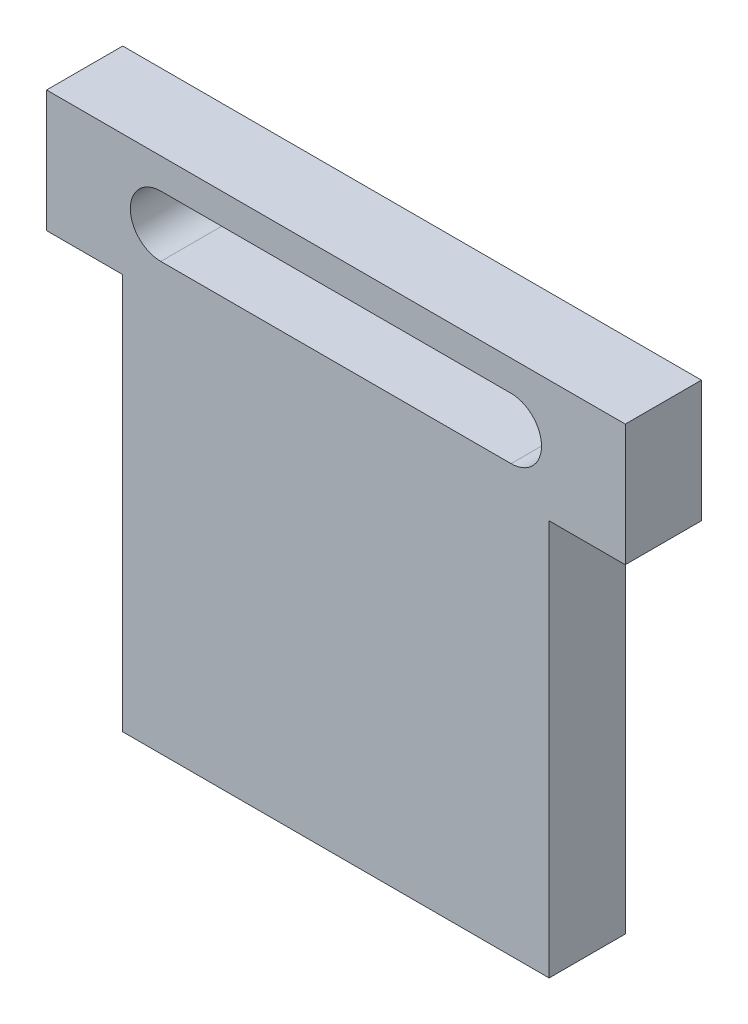
ISO-10303-21;
HEADER;
FILE_DESCRIPTION(('STEP AP214'),'2;1');
FILE_NAME('part.step','',(''),(''),'','','');
FILE_SCHEMA(('AUTOMOTIVE_DESIGN { 1 0 10303 214 1 1 1 1 }'));
ENDSEC;
DATA;
#1=APPLICATION_CONTEXT('core data for automotive mechanical design processes');
#2=APPLICATION_PROTOCOL_DEFINITION('international standard','automotive_design',2000,#1);
#3=PRODUCT_CONTEXT('',#1,'mechanical');
#4=PRODUCT('Part','Part','',(#3));
#5=PRODUCT_RELATED_PRODUCT_CATEGORY('part','',(#4));
#6=PRODUCT_DEFINITION_FORMATION('','',#4);
#7=PRODUCT_DEFINITION_CONTEXT('part definition',#1,'design');
#8=PRODUCT_DEFINITION('design','',#6,#7);
#9=PRODUCT_DEFINITION_SHAPE('','',#8);
#10=(LENGTH_UNIT() NAMED_UNIT(*) SI_UNIT(.MILLI.,.METRE.));
#11=(NAMED_UNIT(*) PLANE_ANGLE_UNIT() SI_UNIT($,.RADIAN.));
#12=(NAMED_UNIT(*) SI_UNIT($,.STERADIAN.) SOLID_ANGLE_UNIT());
#13=UNCERTAINTY_MEASURE_WITH_UNIT(LENGTH_MEASURE(1.E-05),#10,'distance_accuracy_value','');
#14=(GEOMETRIC_REPRESENTATION_CONTEXT(3) GLOBAL_UNCERTAINTY_ASSIGNED_CONTEXT((#13)) GLOBAL_UNIT_ASSIGNED_CONTEXT((#10,
#11,#12)) REPRESENTATION_CONTEXT('',''));
#15=CARTESIAN_POINT('',(0.,0.,0.));
#16=DIRECTION('',(0.,0.,1.));
#17=DIRECTION('',(1.,0.,0.));
#18=AXIS2_PLACEMENT_3D('',#15,#16,#17);
#19=CARTESIAN_POINT('',(-19.,28.5,-9.5));
#20=DIRECTION('',(-1.,0.,0.));
#21=DIRECTION('',(0.,0.,1.));
#22=AXIS2_PLACEMENT_3D('',#19,#20,#21);
#23=PLANE('',#22);
#24=DIRECTION('',(0.,-1.,0.));
#25=VECTOR('',#24,1.);
#26=CARTESIAN_POINT('',(-19.,28.5,-4.5));
#27=LINE('',#26,#25);
#28=CARTESIAN_POINT('',(-19.,36.5,-4.5));
#29=VERTEX_POINT('',#28);
#30=CARTESIAN_POINT('',(-19.,28.5,-4.5));
#31=VERTEX_POINT('',#30);
#32=EDGE_CURVE('E150',#29,#31,#27,.T.);
#33=ORIENTED_EDGE('',*,*,#32,.F.);
#34=DIRECTION('',(0.,0.,1.));
#35=VECTOR('',#34,1.);
#36=CARTESIAN_POINT('',(-19.,36.5,-9.5));
#37=LINE('',#36,#35);
#38=CARTESIAN_POINT('',(-19.,36.5,-9.5));
#39=VERTEX_POINT('',#38);
#40=EDGE_CURVE('E203',#39,#29,#37,.T.);
#41=ORIENTED_EDGE('',*,*,#40,.F.);
#42=DIRECTION('',(0.,-1.,0.));
#43=VECTOR('',#42,1.);
#44=CARTESIAN_POINT('',(-19.,28.5,-9.5));
#45=LINE('',#44,#43);
#46=CARTESIAN_POINT('',(-19.,28.5,-9.5));
#47=VERTEX_POINT('',#46);
#48=EDGE_CURVE('E155',#39,#47,#45,.T.);
#49=ORIENTED_EDGE('',*,*,#48,.T.);
#50=DIRECTION('',(0.,0.,1.));
#51=VECTOR('',#50,1.);
#52=CARTESIAN_POINT('',(-19.,28.5,-9.5));
#53=LINE('',#52,#51);
#54=EDGE_CURVE('E180',#47,#31,#53,.T.);
#55=ORIENTED_EDGE('',*,*,#54,.T.);
#56=EDGE_LOOP('',(#33,#41,#49,#55));
#57=FACE_BOUND('',#56,.T.);
#58=ADVANCED_FACE('F39',(#57),#23,.T.);
#59=CARTESIAN_POINT('',(-19.,36.5,-9.5));
#60=DIRECTION('',(0.,1.,0.));
#61=DIRECTION('',(0.,0.,1.));
#62=AXIS2_PLACEMENT_3D('',#59,#60,#61);
#63=PLANE('',#62);
#64=DIRECTION('',(-1.,0.,0.));
#65=VECTOR('',#64,1.);
#66=CARTESIAN_POINT('',(-19.,36.5,-4.5));
#67=LINE('',#66,#65);
#68=CARTESIAN_POINT('',(19.,36.5,-4.5));
#69=VERTEX_POINT('',#68);
#70=EDGE_CURVE('E159',#69,#29,#67,.T.);
#71=ORIENTED_EDGE('',*,*,#70,.F.);
#72=DIRECTION('',(0.,0.,1.));
#73=VECTOR('',#72,1.);
#74=CARTESIAN_POINT('',(19.,36.5,-9.5));
#75=LINE('',#74,#73);
#76=CARTESIAN_POINT('',(19.,36.5,-9.5));
#77=VERTEX_POINT('',#76);
#78=EDGE_CURVE('E206',#77,#69,#75,.T.);
#79=ORIENTED_EDGE('',*,*,#78,.F.);
#80=DIRECTION('',(-1.,0.,0.));
#81=VECTOR('',#80,1.);
#82=CARTESIAN_POINT('',(-19.,36.5,-9.5));
#83=LINE('',#82,#81);
#84=EDGE_CURVE('E177',#77,#39,#83,.T.);
#85=ORIENTED_EDGE('',*,*,#84,.T.);
#86=ORIENTED_EDGE('',*,*,#40,.T.);
#87=EDGE_LOOP('',(#71,#79,#85,#86));
#88=FACE_BOUND('',#87,.T.);
#89=ADVANCED_FACE('F238',(#88),#63,.T.);
#90=CARTESIAN_POINT('',(19.,36.5,-9.5));
#91=DIRECTION('',(1.,0.,0.));
#92=DIRECTION('',(0.,0.,-1.));
#93=AXIS2_PLACEMENT_3D('',#90,#91,#92);
#94=PLANE('',#93);
#95=DIRECTION('',(0.,1.,0.));
#96=VECTOR('',#95,1.);
#97=CARTESIAN_POINT('',(19.,36.5,-4.5));
#98=LINE('',#97,#96);
#99=CARTESIAN_POINT('',(19.,28.5,-4.5));
#100=VERTEX_POINT('',#99);
#101=EDGE_CURVE('E198',#100,#69,#98,.T.);
#102=ORIENTED_EDGE('',*,*,#101,.F.);
#103=DIRECTION('',(0.,0.,1.));
#104=VECTOR('',#103,1.);
#105=CARTESIAN_POINT('',(19.,28.5,-9.5));
#106=LINE('',#105,#104);
#107=CARTESIAN_POINT('',(19.,28.5,-9.5));
#108=VERTEX_POINT('',#107);
#109=EDGE_CURVE('E208',#108,#100,#106,.T.);
#110=ORIENTED_EDGE('',*,*,#109,.F.);
#111=DIRECTION('',(0.,1.,0.));
#112=VECTOR('',#111,1.);
#113=CARTESIAN_POINT('',(19.,36.5,-9.5));
#114=LINE('',#113,#112);
#115=EDGE_CURVE('E174',#108,#77,#114,.T.);
#116=ORIENTED_EDGE('',*,*,#115,.T.);
#117=ORIENTED_EDGE('',*,*,#78,.T.);
#118=EDGE_LOOP('',(#102,#110,#116,#117));
#119=FACE_BOUND('',#118,.T.);
#120=ADVANCED_FACE('F243',(#119),#94,.T.);
#121=CARTESIAN_POINT('',(19.,28.5,-9.5));
#122=DIRECTION('',(0.,-1.,0.));
#123=DIRECTION('',(0.,0.,-1.));
#124=AXIS2_PLACEMENT_3D('',#121,#122,#123);
#125=PLANE('',#124);
#126=DIRECTION('',(1.,0.,0.));
#127=VECTOR('',#126,1.);
#128=CARTESIAN_POINT('',(19.,28.5,-4.5));
#129=LINE('',#128,#127);
#130=CARTESIAN_POINT('',(14.,28.5,-4.5));
#131=VERTEX_POINT('',#130);
#132=EDGE_CURVE('E195',#131,#100,#129,.T.);
#133=ORIENTED_EDGE('',*,*,#132,.F.);
#134=DIRECTION('',(0.,0.,1.));
#135=VECTOR('',#134,1.);
#136=CARTESIAN_POINT('',(14.,28.5,-9.5));
#137=LINE('',#136,#135);
#138=CARTESIAN_POINT('',(14.,28.5,-9.5));
#139=VERTEX_POINT('',#138);
#140=EDGE_CURVE('E210',#139,#131,#137,.T.);
#141=ORIENTED_EDGE('',*,*,#140,.F.);
#142=DIRECTION('',(1.,0.,0.));
#143=VECTOR('',#142,1.);
#144=CARTESIAN_POINT('',(19.,28.5,-9.5));
#145=LINE('',#144,#143);
#146=EDGE_CURVE('E171',#139,#108,#145,.T.);
#147=ORIENTED_EDGE('',*,*,#146,.T.);
#148=ORIENTED_EDGE('',*,*,#109,.T.);
#149=EDGE_LOOP('',(#133,#141,#147,#148));
#150=FACE_BOUND('',#149,.T.);
#151=ADVANCED_FACE('F271',(#150),#125,.T.);
#152=CARTESIAN_POINT('',(14.,28.5,-9.5));
#153=DIRECTION('',(1.,0.,0.));
#154=DIRECTION('',(0.,0.,-1.));
#155=AXIS2_PLACEMENT_3D('',#152,#153,#154);
#156=PLANE('',#155);
#157=DIRECTION('',(0.,1.,0.));
#158=VECTOR('',#157,1.);
#159=CARTESIAN_POINT('',(14.,28.5,-4.5));
#160=LINE('',#159,#158);
#161=CARTESIAN_POINT('',(14.,2.5,-4.5));
#162=VERTEX_POINT('',#161);
#163=EDGE_CURVE('E192',#162,#131,#160,.T.);
#164=ORIENTED_EDGE('',*,*,#163,.F.);
#165=DIRECTION('',(0.,0.,1.));
#166=VECTOR('',#165,1.);
#167=CARTESIAN_POINT('',(14.,2.5,-9.5));
#168=LINE('',#167,#166);
#169=CARTESIAN_POINT('',(14.,2.5,-9.5));
#170=VERTEX_POINT('',#169);
#171=EDGE_CURVE('E212',#170,#162,#168,.T.);
#172=ORIENTED_EDGE('',*,*,#171,.F.);
#173=DIRECTION('',(0.,1.,0.));
#174=VECTOR('',#173,1.);
#175=CARTESIAN_POINT('',(14.,28.5,-9.5));
#176=LINE('',#175,#174);
#177=EDGE_CURVE('E168',#170,#139,#176,.T.);
#178=ORIENTED_EDGE('',*,*,#177,.T.);
#179=ORIENTED_EDGE('',*,*,#140,.T.);
#180=EDGE_LOOP('',(#164,#172,#178,#179));
#181=FACE_BOUND('',#180,.T.);
#182=ADVANCED_FACE('F268',(#181),#156,.T.);
#183=CARTESIAN_POINT('',(14.,2.5,-9.5));
#184=DIRECTION('',(0.,-1.,0.));
#185=DIRECTION('',(0.,0.,-1.));
#186=AXIS2_PLACEMENT_3D('',#183,#184,#185);
#187=PLANE('',#186);
#188=DIRECTION('',(1.,0.,0.));
#189=VECTOR('',#188,1.);
#190=CARTESIAN_POINT('',(14.,2.5,-4.5));
#191=LINE('',#190,#189);
#192=CARTESIAN_POINT('',(-14.,2.5,-4.5));
#193=VERTEX_POINT('',#192);
#194=EDGE_CURVE('E189',#193,#162,#191,.T.);
#195=ORIENTED_EDGE('',*,*,#194,.F.);
#196=DIRECTION('',(0.,0.,1.));
#197=VECTOR('',#196,1.);
#198=CARTESIAN_POINT('',(-14.,2.5,-9.5));
#199=LINE('',#198,#197);
#200=CARTESIAN_POINT('',(-14.,2.5,-9.5));
#201=VERTEX_POINT('',#200);
#202=EDGE_CURVE('E214',#201,#193,#199,.T.);
#203=ORIENTED_EDGE('',*,*,#202,.F.);
#204=DIRECTION('',(1.,0.,0.));
#205=VECTOR('',#204,1.);
#206=CARTESIAN_POINT('',(14.,2.5,-9.5));
#207=LINE('',#206,#205);
#208=EDGE_CURVE('E165',#201,#170,#207,.T.);
#209=ORIENTED_EDGE('',*,*,#208,.T.);
#210=ORIENTED_EDGE('',*,*,#171,.T.);
#211=EDGE_LOOP('',(#195,#203,#209,#210));
#212=FACE_BOUND('',#211,.T.);
#213=ADVANCED_FACE('F264',(#212),#187,.T.);
#214=CARTESIAN_POINT('',(-14.,2.5,-9.5));
#215=DIRECTION('',(-1.,0.,0.));
#216=DIRECTION('',(0.,0.,1.));
#217=AXIS2_PLACEMENT_3D('',#214,#215,#216);
#218=PLANE('',#217);
#219=DIRECTION('',(0.,-1.,0.));
#220=VECTOR('',#219,1.);
#221=CARTESIAN_POINT('',(-14.,2.5,-4.5));
#222=LINE('',#221,#220);
#223=CARTESIAN_POINT('',(-14.,28.5,-4.5));
#224=VERTEX_POINT('',#223);
#225=EDGE_CURVE('E186',#224,#193,#222,.T.);
#226=ORIENTED_EDGE('',*,*,#225,.F.);
#227=DIRECTION('',(0.,0.,1.));
#228=VECTOR('',#227,1.);
#229=CARTESIAN_POINT('',(-14.,28.5,-9.5));
#230=LINE('',#229,#228);
#231=CARTESIAN_POINT('',(-14.,28.5,-9.5));
#232=VERTEX_POINT('',#231);
#233=EDGE_CURVE('E216',#232,#224,#230,.T.);
#234=ORIENTED_EDGE('',*,*,#233,.F.);
#235=DIRECTION('',(0.,-1.,0.));
#236=VECTOR('',#235,1.);
#237=CARTESIAN_POINT('',(-14.,2.5,-9.5));
#238=LINE('',#237,#236);
#239=EDGE_CURVE('E162',#232,#201,#238,.T.);
#240=ORIENTED_EDGE('',*,*,#239,.T.);
#241=ORIENTED_EDGE('',*,*,#202,.T.);
#242=EDGE_LOOP('',(#226,#234,#240,#241));
#243=FACE_BOUND('',#242,.T.);
#244=ADVANCED_FACE('F262',(#243),#218,.T.);
#245=CARTESIAN_POINT('',(-14.,28.5,-9.5));
#246=DIRECTION('',(0.,-1.,0.));
#247=DIRECTION('',(0.,0.,-1.));
#248=AXIS2_PLACEMENT_3D('',#245,#246,#247);
#249=PLANE('',#248);
#250=DIRECTION('',(1.,0.,0.));
#251=VECTOR('',#250,1.);
#252=CARTESIAN_POINT('',(-14.,28.5,-4.5));
#253=LINE('',#252,#251);
#254=EDGE_CURVE('E183',#31,#224,#253,.T.);
#255=ORIENTED_EDGE('',*,*,#254,.F.);
#256=ORIENTED_EDGE('',*,*,#54,.F.);
#257=DIRECTION('',(1.,0.,0.));
#258=VECTOR('',#257,1.);
#259=CARTESIAN_POINT('',(-14.,28.5,-9.5));
#260=LINE('',#259,#258);
#261=EDGE_CURVE('E158',#47,#232,#260,.T.);
#262=ORIENTED_EDGE('',*,*,#261,.T.);
#263=ORIENTED_EDGE('',*,*,#233,.T.);
#264=EDGE_LOOP('',(#255,#256,#262,#263));
#265=FACE_BOUND('',#264,.T.);
#266=ADVANCED_FACE('F258',(#265),#249,.T.);
#267=CARTESIAN_POINT('',(0.,0.,-9.5));
#268=DIRECTION('',(0.,0.,-1.));
#269=DIRECTION('',(-1.,0.,0.));
#270=AXIS2_PLACEMENT_3D('',#267,#268,#269);
#271=PLANE('',#270);
#272=CARTESIAN_POINT('',(-11.5,32.5,-9.5));
#273=DIRECTION('',(0.,0.,1.));
#274=DIRECTION('',(-1.,0.,0.));
#275=AXIS2_PLACEMENT_3D('',#272,#273,#274);
#276=CIRCLE('',#275,2.);
#277=CARTESIAN_POINT('',(-11.5,34.5,-9.5));
#278=VERTEX_POINT('',#277);
#279=CARTESIAN_POINT('',(-11.5,30.5,-9.5));
#280=VERTEX_POINT('',#279);
#281=EDGE_CURVE('E130',#278,#280,#276,.T.);
#282=ORIENTED_EDGE('',*,*,#281,.T.);
#283=DIRECTION('',(1.,0.,0.));
#284=VECTOR('',#283,1.);
#285=CARTESIAN_POINT('',(11.5,30.5,-9.5));
#286=LINE('',#285,#284);
#287=CARTESIAN_POINT('',(11.5,30.5,-9.5));
#288=VERTEX_POINT('',#287);
#289=EDGE_CURVE('E137',#280,#288,#286,.T.);
#290=ORIENTED_EDGE('',*,*,#289,.T.);
#291=CARTESIAN_POINT('',(11.5,32.5,-9.5));
#292=DIRECTION('',(0.,0.,1.));
#293=DIRECTION('',(-1.,0.,0.));
#294=AXIS2_PLACEMENT_3D('',#291,#292,#293);
#295=CIRCLE('',#294,2.);
#296=CARTESIAN_POINT('',(11.5,34.5,-9.5));
#297=VERTEX_POINT('',#296);
#298=EDGE_CURVE('E53',#288,#297,#295,.T.);
#299=ORIENTED_EDGE('',*,*,#298,.T.);
#300=DIRECTION('',(-1.,0.,0.));
#301=VECTOR('',#300,1.);
#302=CARTESIAN_POINT('',(-11.5,34.5,-9.5));
#303=LINE('',#302,#301);
#304=EDGE_CURVE('E134',#297,#278,#303,.T.);
#305=ORIENTED_EDGE('',*,*,#304,.T.);
#306=EDGE_LOOP('',(#282,#290,#299,#305));
#307=FACE_BOUND('',#306,.T.);
#308=ORIENTED_EDGE('',*,*,#48,.F.);
#309=ORIENTED_EDGE('',*,*,#84,.F.);
#310=ORIENTED_EDGE('',*,*,#115,.F.);
#311=ORIENTED_EDGE('',*,*,#146,.F.);
#312=ORIENTED_EDGE('',*,*,#177,.F.);
#313=ORIENTED_EDGE('',*,*,#208,.F.);
#314=ORIENTED_EDGE('',*,*,#239,.F.);
#315=ORIENTED_EDGE('',*,*,#261,.F.);
#316=EDGE_LOOP('',(#308,#309,#310,#311,#312,#313,#314,#315));
#317=FACE_BOUND('',#316,.T.);
#318=ADVANCED_FACE('F141',(#307,#317),#271,.T.);
#319=CARTESIAN_POINT('',(0.,0.,-4.5));
#320=DIRECTION('',(0.,0.,-1.));
#321=DIRECTION('',(-1.,0.,0.));
#322=AXIS2_PLACEMENT_3D('',#319,#320,#321);
#323=PLANE('',#322);
#324=DIRECTION('',(-1.,0.,0.));
#325=VECTOR('',#324,1.);
#326=CARTESIAN_POINT('',(0.,30.5,-4.5));
#327=LINE('',#326,#325);
#328=CARTESIAN_POINT('',(11.5,30.5,-4.5));
#329=VERTEX_POINT('',#328);
#330=CARTESIAN_POINT('',(-11.5,30.5,-4.5));
#331=VERTEX_POINT('',#330);
#332=EDGE_CURVE('E205',#329,#331,#327,.T.);
#333=ORIENTED_EDGE('',*,*,#332,.T.);
#334=CARTESIAN_POINT('',(-11.5,32.5,-4.5));
#335=DIRECTION('',(0.,0.,-1.));
#336=DIRECTION('',(-1.,0.,0.));
#337=AXIS2_PLACEMENT_3D('',#334,#335,#336);
#338=CIRCLE('',#337,2.);
#339=CARTESIAN_POINT('',(-11.5,34.5,-4.5));
#340=VERTEX_POINT('',#339);
#341=EDGE_CURVE('E11',#331,#340,#338,.T.);
#342=ORIENTED_EDGE('',*,*,#341,.T.);
#343=DIRECTION('',(1.,0.,0.));
#344=VECTOR('',#343,1.);
#345=CARTESIAN_POINT('',(0.,34.5,-4.5));
#346=LINE('',#345,#344);
#347=CARTESIAN_POINT('',(11.5,34.5,-4.5));
#348=VERTEX_POINT('',#347);
#349=EDGE_CURVE('E46',#340,#348,#346,.T.);
#350=ORIENTED_EDGE('',*,*,#349,.T.);
#351=CARTESIAN_POINT('',(11.5,32.5,-4.5));
#352=DIRECTION('',(0.,0.,-1.));
#353=DIRECTION('',(-1.,0.,0.));
#354=AXIS2_PLACEMENT_3D('',#351,#352,#353);
#355=CIRCLE('',#354,2.);
#356=EDGE_CURVE('E220',#348,#329,#355,.T.);
#357=ORIENTED_EDGE('',*,*,#356,.T.);
#358=EDGE_LOOP('',(#333,#342,#350,#357));
#359=FACE_BOUND('',#358,.T.);
#360=ORIENTED_EDGE('',*,*,#32,.T.);
#361=ORIENTED_EDGE('',*,*,#254,.T.);
#362=ORIENTED_EDGE('',*,*,#225,.T.);
#363=ORIENTED_EDGE('',*,*,#194,.T.);
#364=ORIENTED_EDGE('',*,*,#163,.T.);
#365=ORIENTED_EDGE('',*,*,#132,.T.);
#366=ORIENTED_EDGE('',*,*,#101,.T.);
#367=ORIENTED_EDGE('',*,*,#70,.T.);
#368=EDGE_LOOP('',(#360,#361,#362,#363,#364,#365,#366,#367));
#369=FACE_BOUND('',#368,.T.);
#370=ADVANCED_FACE('F224',(#359,#369),#323,.F.);
#371=CARTESIAN_POINT('',(-11.5,32.5,-9.5));
#372=DIRECTION('',(0.,0.,1.));
#373=DIRECTION('',(1.,0.,0.));
#374=AXIS2_PLACEMENT_3D('',#371,#372,#373);
#375=CYLINDRICAL_SURFACE('',#374,2.);
#376=DIRECTION('',(0.,0.,1.));
#377=VECTOR('',#376,1.);
#378=CARTESIAN_POINT('',(-11.5,30.5,-9.5));
#379=LINE('',#378,#377);
#380=EDGE_CURVE('E61',#280,#331,#379,.T.);
#381=ORIENTED_EDGE('',*,*,#380,.F.);
#382=ORIENTED_EDGE('',*,*,#281,.F.);
#383=DIRECTION('',(0.,0.,1.));
#384=VECTOR('',#383,1.);
#385=CARTESIAN_POINT('',(-11.5,34.5,-9.5));
#386=LINE('',#385,#384);
#387=EDGE_CURVE('E148',#278,#340,#386,.T.);
#388=ORIENTED_EDGE('',*,*,#387,.T.);
#389=ORIENTED_EDGE('',*,*,#341,.F.);
#390=EDGE_LOOP('',(#381,#382,#388,#389));
#391=FACE_BOUND('',#390,.T.);
#392=ADVANCED_FACE('F127',(#391),#375,.F.);
#393=CARTESIAN_POINT('',(-11.5,34.5,-9.5));
#394=DIRECTION('',(0.,1.,0.));
#395=DIRECTION('',(0.,0.,1.));
#396=AXIS2_PLACEMENT_3D('',#393,#394,#395);
#397=PLANE('',#396);
#398=ORIENTED_EDGE('',*,*,#387,.F.);
#399=ORIENTED_EDGE('',*,*,#304,.F.);
#400=DIRECTION('',(0.,0.,1.));
#401=VECTOR('',#400,1.);
#402=CARTESIAN_POINT('',(11.5,34.5,-9.5));
#403=LINE('',#402,#401);
#404=EDGE_CURVE('E151',#297,#348,#403,.T.);
#405=ORIENTED_EDGE('',*,*,#404,.T.);
#406=ORIENTED_EDGE('',*,*,#349,.F.);
#407=EDGE_LOOP('',(#398,#399,#405,#406));
#408=FACE_BOUND('',#407,.T.);
#409=ADVANCED_FACE('F227',(#408),#397,.F.);
#410=CARTESIAN_POINT('',(11.5,32.5,-9.5));
#411=DIRECTION('',(0.,0.,1.));
#412=DIRECTION('',(1.,0.,0.));
#413=AXIS2_PLACEMENT_3D('',#410,#411,#412);
#414=CYLINDRICAL_SURFACE('',#413,2.);
#415=ORIENTED_EDGE('',*,*,#404,.F.);
#416=ORIENTED_EDGE('',*,*,#298,.F.);
#417=DIRECTION('',(0.,0.,1.));
#418=VECTOR('',#417,1.);
#419=CARTESIAN_POINT('',(11.5,30.5,-9.5));
#420=LINE('',#419,#418);
#421=EDGE_CURVE('E133',#288,#329,#420,.T.);
#422=ORIENTED_EDGE('',*,*,#421,.T.);
#423=ORIENTED_EDGE('',*,*,#356,.F.);
#424=EDGE_LOOP('',(#415,#416,#422,#423));
#425=FACE_BOUND('',#424,.T.);
#426=ADVANCED_FACE('F228',(#425),#414,.F.);
#427=CARTESIAN_POINT('',(11.5,30.5,-9.5));
#428=DIRECTION('',(0.,-1.,0.));
#429=DIRECTION('',(0.,0.,-1.));
#430=AXIS2_PLACEMENT_3D('',#427,#428,#429);
#431=PLANE('',#430);
#432=ORIENTED_EDGE('',*,*,#421,.F.);
#433=ORIENTED_EDGE('',*,*,#289,.F.);
#434=ORIENTED_EDGE('',*,*,#380,.T.);
#435=ORIENTED_EDGE('',*,*,#332,.F.);
#436=EDGE_LOOP('',(#432,#433,#434,#435));
#437=FACE_BOUND('',#436,.T.);
#438=ADVANCED_FACE('F138',(#437),#431,.F.);
#439=CLOSED_SHELL('',(#58,#89,#120,#151,#182,#213,#244,#266,#318,#370,#392,#409,#426,#438));
#440=MANIFOLD_SOLID_BREP('B2',#439);
#441=ADVANCED_BREP_SHAPE_REPRESENTATION('',(#18,#440),#14);
#442=SHAPE_DEFINITION_REPRESENTATION(#9,#441);
ENDSEC;
END-ISO-10303-21;
